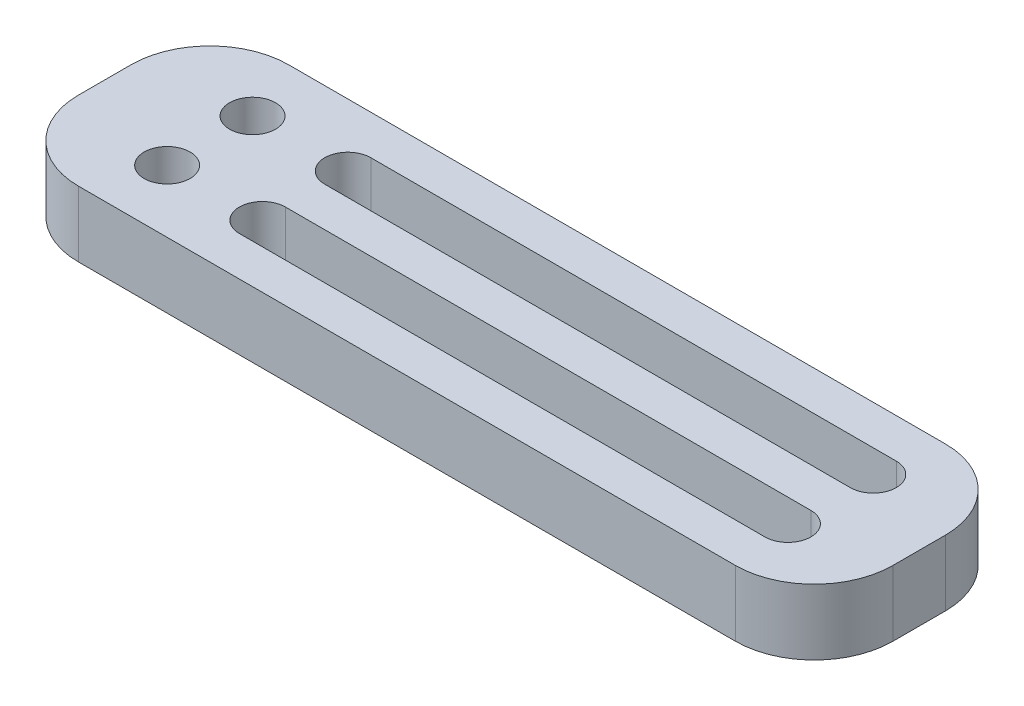
ISO-10303-21;
HEADER;
FILE_DESCRIPTION(('STEP AP214'),'2;1');
FILE_NAME('part.step','',(''),(''),'','','');
FILE_SCHEMA(('AUTOMOTIVE_DESIGN { 1 0 10303 214 1 1 1 1 }'));
ENDSEC;
DATA;
#1=APPLICATION_CONTEXT('core data for automotive mechanical design processes');
#2=APPLICATION_PROTOCOL_DEFINITION('international standard','automotive_design',2000,#1);
#3=PRODUCT_CONTEXT('',#1,'mechanical');
#4=PRODUCT('Part','Part','',(#3));
#5=PRODUCT_RELATED_PRODUCT_CATEGORY('part','',(#4));
#6=PRODUCT_DEFINITION_FORMATION('','',#4);
#7=PRODUCT_DEFINITION_CONTEXT('part definition',#1,'design');
#8=PRODUCT_DEFINITION('design','',#6,#7);
#9=PRODUCT_DEFINITION_SHAPE('','',#8);
#10=(LENGTH_UNIT() NAMED_UNIT(*) SI_UNIT(.MILLI.,.METRE.));
#11=(NAMED_UNIT(*) PLANE_ANGLE_UNIT() SI_UNIT($,.RADIAN.));
#12=(NAMED_UNIT(*) SI_UNIT($,.STERADIAN.) SOLID_ANGLE_UNIT());
#13=UNCERTAINTY_MEASURE_WITH_UNIT(LENGTH_MEASURE(1.E-05),#10,'distance_accuracy_value','');
#14=(GEOMETRIC_REPRESENTATION_CONTEXT(3) GLOBAL_UNCERTAINTY_ASSIGNED_CONTEXT((#13)) GLOBAL_UNIT_ASSIGNED_CONTEXT((#10,
#11,#12)) REPRESENTATION_CONTEXT('',''));
#15=CARTESIAN_POINT('',(0.,0.,0.));
#16=DIRECTION('',(0.,0.,1.));
#17=DIRECTION('',(1.,0.,0.));
#18=AXIS2_PLACEMENT_3D('',#15,#16,#17);
#19=CARTESIAN_POINT('',(56.,-5.,4.));
#20=DIRECTION('',(0.,1.,0.));
#21=DIRECTION('',(0.,0.,1.));
#22=AXIS2_PLACEMENT_3D('',#19,#20,#21);
#23=CYLINDRICAL_SURFACE('',#22,6.);
#24=CARTESIAN_POINT('',(56.,0.,4.));
#25=DIRECTION('',(0.,1.,0.));
#26=DIRECTION('',(0.,0.,-1.));
#27=AXIS2_PLACEMENT_3D('',#24,#25,#26);
#28=CIRCLE('',#27,6.);
#29=CARTESIAN_POINT('',(56.,0.,10.));
#30=VERTEX_POINT('',#29);
#31=CARTESIAN_POINT('',(62.,0.,4.));
#32=VERTEX_POINT('',#31);
#33=EDGE_CURVE('E221',#30,#32,#28,.T.);
#34=ORIENTED_EDGE('',*,*,#33,.F.);
#35=DIRECTION('',(0.,1.,0.));
#36=VECTOR('',#35,1.);
#37=CARTESIAN_POINT('',(56.,-5.,10.));
#38=LINE('',#37,#36);
#39=CARTESIAN_POINT('',(56.,-5.,10.));
#40=VERTEX_POINT('',#39);
#41=EDGE_CURVE('E11',#40,#30,#38,.T.);
#42=ORIENTED_EDGE('',*,*,#41,.F.);
#43=CARTESIAN_POINT('',(56.,-5.,4.));
#44=DIRECTION('',(0.,1.,0.));
#45=DIRECTION('',(0.,0.,-1.));
#46=AXIS2_PLACEMENT_3D('',#43,#44,#45);
#47=CIRCLE('',#46,6.);
#48=CARTESIAN_POINT('',(62.,-5.,4.));
#49=VERTEX_POINT('',#48);
#50=EDGE_CURVE('E224',#40,#49,#47,.T.);
#51=ORIENTED_EDGE('',*,*,#50,.T.);
#52=DIRECTION('',(0.,1.,0.));
#53=VECTOR('',#52,1.);
#54=CARTESIAN_POINT('',(62.,-5.,4.));
#55=LINE('',#54,#53);
#56=EDGE_CURVE('E35',#49,#32,#55,.T.);
#57=ORIENTED_EDGE('',*,*,#56,.T.);
#58=EDGE_LOOP('',(#34,#42,#51,#57));
#59=FACE_BOUND('',#58,.T.);
#60=ADVANCED_FACE('F32',(#59),#23,.T.);
#61=CARTESIAN_POINT('',(6.,-5.,10.));
#62=DIRECTION('',(0.,0.,1.));
#63=DIRECTION('',(1.,0.,0.));
#64=AXIS2_PLACEMENT_3D('',#61,#62,#63);
#65=PLANE('',#64);
#66=DIRECTION('',(1.,0.,0.));
#67=VECTOR('',#66,1.);
#68=CARTESIAN_POINT('',(6.,0.,10.));
#69=LINE('',#68,#67);
#70=CARTESIAN_POINT('',(6.,0.,10.));
#71=VERTEX_POINT('',#70);
#72=EDGE_CURVE('E228',#71,#30,#69,.T.);
#73=ORIENTED_EDGE('',*,*,#72,.F.);
#74=DIRECTION('',(0.,1.,0.));
#75=VECTOR('',#74,1.);
#76=CARTESIAN_POINT('',(6.,-5.,10.));
#77=LINE('',#76,#75);
#78=CARTESIAN_POINT('',(6.,-5.,10.));
#79=VERTEX_POINT('',#78);
#80=EDGE_CURVE('E40',#79,#71,#77,.T.);
#81=ORIENTED_EDGE('',*,*,#80,.F.);
#82=DIRECTION('',(1.,0.,0.));
#83=VECTOR('',#82,1.);
#84=CARTESIAN_POINT('',(6.,-5.,10.));
#85=LINE('',#84,#83);
#86=EDGE_CURVE('E246',#79,#40,#85,.T.);
#87=ORIENTED_EDGE('',*,*,#86,.T.);
#88=ORIENTED_EDGE('',*,*,#41,.T.);
#89=EDGE_LOOP('',(#73,#81,#87,#88));
#90=FACE_BOUND('',#89,.T.);
#91=ADVANCED_FACE('F293',(#90),#65,.T.);
#92=CARTESIAN_POINT('',(6.,-5.,4.));
#93=DIRECTION('',(0.,1.,0.));
#94=DIRECTION('',(0.,0.,1.));
#95=AXIS2_PLACEMENT_3D('',#92,#93,#94);
#96=CYLINDRICAL_SURFACE('',#95,6.);
#97=CARTESIAN_POINT('',(6.,0.,4.));
#98=DIRECTION('',(0.,1.,0.));
#99=DIRECTION('',(0.,0.,-1.));
#100=AXIS2_PLACEMENT_3D('',#97,#98,#99);
#101=CIRCLE('',#100,6.);
#102=CARTESIAN_POINT('',(0.,0.,4.));
#103=VERTEX_POINT('',#102);
#104=EDGE_CURVE('E266',#103,#71,#101,.T.);
#105=ORIENTED_EDGE('',*,*,#104,.F.);
#106=DIRECTION('',(0.,1.,0.));
#107=VECTOR('',#106,1.);
#108=CARTESIAN_POINT('',(0.,-5.,4.));
#109=LINE('',#108,#107);
#110=CARTESIAN_POINT('',(0.,-5.,4.));
#111=VERTEX_POINT('',#110);
#112=EDGE_CURVE('E272',#111,#103,#109,.T.);
#113=ORIENTED_EDGE('',*,*,#112,.F.);
#114=CARTESIAN_POINT('',(6.,-5.,4.));
#115=DIRECTION('',(0.,1.,0.));
#116=DIRECTION('',(0.,0.,-1.));
#117=AXIS2_PLACEMENT_3D('',#114,#115,#116);
#118=CIRCLE('',#117,6.);
#119=EDGE_CURVE('E243',#111,#79,#118,.T.);
#120=ORIENTED_EDGE('',*,*,#119,.T.);
#121=ORIENTED_EDGE('',*,*,#80,.T.);
#122=EDGE_LOOP('',(#105,#113,#120,#121));
#123=FACE_BOUND('',#122,.T.);
#124=ADVANCED_FACE('F313',(#123),#96,.T.);
#125=CARTESIAN_POINT('',(0.,-5.,0.));
#126=DIRECTION('',(-1.,0.,0.));
#127=DIRECTION('',(0.,0.,1.));
#128=AXIS2_PLACEMENT_3D('',#125,#126,#127);
#129=PLANE('',#128);
#130=DIRECTION('',(0.,0.,1.));
#131=VECTOR('',#130,1.);
#132=CARTESIAN_POINT('',(0.,0.,0.));
#133=LINE('',#132,#131);
#134=CARTESIAN_POINT('',(0.,0.,0.));
#135=VERTEX_POINT('',#134);
#136=EDGE_CURVE('E263',#135,#103,#133,.T.);
#137=ORIENTED_EDGE('',*,*,#136,.F.);
#138=DIRECTION('',(0.,1.,0.));
#139=VECTOR('',#138,1.);
#140=CARTESIAN_POINT('',(0.,-5.,0.));
#141=LINE('',#140,#139);
#142=CARTESIAN_POINT('',(0.,-5.,0.));
#143=VERTEX_POINT('',#142);
#144=EDGE_CURVE('E274',#143,#135,#141,.T.);
#145=ORIENTED_EDGE('',*,*,#144,.F.);
#146=DIRECTION('',(0.,0.,1.));
#147=VECTOR('',#146,1.);
#148=CARTESIAN_POINT('',(0.,-5.,0.));
#149=LINE('',#148,#147);
#150=EDGE_CURVE('E240',#143,#111,#149,.T.);
#151=ORIENTED_EDGE('',*,*,#150,.T.);
#152=ORIENTED_EDGE('',*,*,#112,.T.);
#153=EDGE_LOOP('',(#137,#145,#151,#152));
#154=FACE_BOUND('',#153,.T.);
#155=ADVANCED_FACE('F311',(#154),#129,.T.);
#156=CARTESIAN_POINT('',(6.,-5.,0.));
#157=DIRECTION('',(0.,1.,0.));
#158=DIRECTION('',(0.,0.,1.));
#159=AXIS2_PLACEMENT_3D('',#156,#157,#158);
#160=CYLINDRICAL_SURFACE('',#159,6.);
#161=CARTESIAN_POINT('',(6.,0.,0.));
#162=DIRECTION('',(0.,1.,0.));
#163=DIRECTION('',(0.,0.,1.));
#164=AXIS2_PLACEMENT_3D('',#161,#162,#163);
#165=CIRCLE('',#164,6.);
#166=CARTESIAN_POINT('',(6.,0.,-6.00000000000001));
#167=VERTEX_POINT('',#166);
#168=EDGE_CURVE('E260',#167,#135,#165,.T.);
#169=ORIENTED_EDGE('',*,*,#168,.F.);
#170=DIRECTION('',(0.,1.,0.));
#171=VECTOR('',#170,1.);
#172=CARTESIAN_POINT('',(6.,-5.,-6.00000000000001));
#173=LINE('',#172,#171);
#174=CARTESIAN_POINT('',(6.,-5.,-6.00000000000001));
#175=VERTEX_POINT('',#174);
#176=EDGE_CURVE('E276',#175,#167,#173,.T.);
#177=ORIENTED_EDGE('',*,*,#176,.F.);
#178=CARTESIAN_POINT('',(6.,-5.,0.));
#179=DIRECTION('',(0.,1.,0.));
#180=DIRECTION('',(0.,0.,1.));
#181=AXIS2_PLACEMENT_3D('',#178,#179,#180);
#182=CIRCLE('',#181,6.);
#183=EDGE_CURVE('E237',#175,#143,#182,.T.);
#184=ORIENTED_EDGE('',*,*,#183,.T.);
#185=ORIENTED_EDGE('',*,*,#144,.T.);
#186=EDGE_LOOP('',(#169,#177,#184,#185));
#187=FACE_BOUND('',#186,.T.);
#188=ADVANCED_FACE('F307',(#187),#160,.T.);
#189=CARTESIAN_POINT('',(6.,-5.,-6.00000000000001));
#190=DIRECTION('',(0.,0.,-1.));
#191=DIRECTION('',(-1.,0.,0.));
#192=AXIS2_PLACEMENT_3D('',#189,#190,#191);
#193=PLANE('',#192);
#194=DIRECTION('',(-1.,0.,0.));
#195=VECTOR('',#194,1.);
#196=CARTESIAN_POINT('',(6.,0.,-6.00000000000001));
#197=LINE('',#196,#195);
#198=CARTESIAN_POINT('',(56.,0.,-6.00000000000001));
#199=VERTEX_POINT('',#198);
#200=EDGE_CURVE('E257',#199,#167,#197,.T.);
#201=ORIENTED_EDGE('',*,*,#200,.F.);
#202=DIRECTION('',(0.,1.,0.));
#203=VECTOR('',#202,1.);
#204=CARTESIAN_POINT('',(56.,-5.,-6.00000000000001));
#205=LINE('',#204,#203);
#206=CARTESIAN_POINT('',(56.,-5.,-6.00000000000001));
#207=VERTEX_POINT('',#206);
#208=EDGE_CURVE('E278',#207,#199,#205,.T.);
#209=ORIENTED_EDGE('',*,*,#208,.F.);
#210=DIRECTION('',(-1.,0.,0.));
#211=VECTOR('',#210,1.);
#212=CARTESIAN_POINT('',(6.,-5.,-6.00000000000001));
#213=LINE('',#212,#211);
#214=EDGE_CURVE('E234',#207,#175,#213,.T.);
#215=ORIENTED_EDGE('',*,*,#214,.T.);
#216=ORIENTED_EDGE('',*,*,#176,.T.);
#217=EDGE_LOOP('',(#201,#209,#215,#216));
#218=FACE_BOUND('',#217,.T.);
#219=ADVANCED_FACE('F305',(#218),#193,.T.);
#220=CARTESIAN_POINT('',(56.,-5.,0.));
#221=DIRECTION('',(0.,1.,0.));
#222=DIRECTION('',(0.,0.,1.));
#223=AXIS2_PLACEMENT_3D('',#220,#221,#222);
#224=CYLINDRICAL_SURFACE('',#223,6.);
#225=CARTESIAN_POINT('',(56.,0.,0.));
#226=DIRECTION('',(0.,1.,0.));
#227=DIRECTION('',(0.,0.,1.));
#228=AXIS2_PLACEMENT_3D('',#225,#226,#227);
#229=CIRCLE('',#228,6.);
#230=CARTESIAN_POINT('',(62.,0.,0.));
#231=VERTEX_POINT('',#230);
#232=EDGE_CURVE('E254',#231,#199,#229,.T.);
#233=ORIENTED_EDGE('',*,*,#232,.F.);
#234=DIRECTION('',(0.,1.,0.));
#235=VECTOR('',#234,1.);
#236=CARTESIAN_POINT('',(62.,-5.,0.));
#237=LINE('',#236,#235);
#238=CARTESIAN_POINT('',(62.,-5.,0.));
#239=VERTEX_POINT('',#238);
#240=EDGE_CURVE('E279',#239,#231,#237,.T.);
#241=ORIENTED_EDGE('',*,*,#240,.F.);
#242=CARTESIAN_POINT('',(56.,-5.,0.));
#243=DIRECTION('',(0.,1.,0.));
#244=DIRECTION('',(0.,0.,1.));
#245=AXIS2_PLACEMENT_3D('',#242,#243,#244);
#246=CIRCLE('',#245,6.);
#247=EDGE_CURVE('E231',#239,#207,#246,.T.);
#248=ORIENTED_EDGE('',*,*,#247,.T.);
#249=ORIENTED_EDGE('',*,*,#208,.T.);
#250=EDGE_LOOP('',(#233,#241,#248,#249));
#251=FACE_BOUND('',#250,.T.);
#252=ADVANCED_FACE('F301',(#251),#224,.T.);
#253=CARTESIAN_POINT('',(62.,-5.,0.));
#254=DIRECTION('',(1.,0.,0.));
#255=DIRECTION('',(0.,0.,-1.));
#256=AXIS2_PLACEMENT_3D('',#253,#254,#255);
#257=PLANE('',#256);
#258=DIRECTION('',(0.,0.,-1.));
#259=VECTOR('',#258,1.);
#260=CARTESIAN_POINT('',(62.,0.,0.));
#261=LINE('',#260,#259);
#262=EDGE_CURVE('E251',#32,#231,#261,.T.);
#263=ORIENTED_EDGE('',*,*,#262,.F.);
#264=ORIENTED_EDGE('',*,*,#56,.F.);
#265=DIRECTION('',(0.,0.,-1.));
#266=VECTOR('',#265,1.);
#267=CARTESIAN_POINT('',(62.,-5.,0.));
#268=LINE('',#267,#266);
#269=EDGE_CURVE('E227',#49,#239,#268,.T.);
#270=ORIENTED_EDGE('',*,*,#269,.T.);
#271=ORIENTED_EDGE('',*,*,#240,.T.);
#272=EDGE_LOOP('',(#263,#264,#270,#271));
#273=FACE_BOUND('',#272,.T.);
#274=ADVANCED_FACE('F287',(#273),#257,.T.);
#275=CARTESIAN_POINT('',(56.,-5.,4.));
#276=DIRECTION('',(0.,-1.,0.));
#277=DIRECTION('',(0.,0.,-1.));
#278=AXIS2_PLACEMENT_3D('',#275,#276,#277);
#279=PLANE('',#278);
#280=CARTESIAN_POINT('',(8.,-5.,5.25));
#281=DIRECTION('',(0.,1.,0.));
#282=DIRECTION('',(0.,0.,-1.));
#283=AXIS2_PLACEMENT_3D('',#280,#281,#282);
#284=CIRCLE('',#283,1.75);
#285=CARTESIAN_POINT('',(8.,-5.,3.5));
#286=VERTEX_POINT('',#285);
#287=EDGE_CURVE('E176',#286,#286,#284,.T.);
#288=ORIENTED_EDGE('',*,*,#287,.T.);
#289=EDGE_LOOP('',(#288));
#290=FACE_BOUND('',#289,.T.);
#291=CARTESIAN_POINT('',(15.25,-5.,-1.25));
#292=DIRECTION('',(0.,1.,0.));
#293=DIRECTION('',(0.,0.,1.));
#294=AXIS2_PLACEMENT_3D('',#291,#292,#293);
#295=CIRCLE('',#294,1.75);
#296=CARTESIAN_POINT('',(15.25,-5.,-3.));
#297=VERTEX_POINT('',#296);
#298=CARTESIAN_POINT('',(15.25,-5.,0.499999999999999));
#299=VERTEX_POINT('',#298);
#300=EDGE_CURVE('E147',#297,#299,#295,.T.);
#301=ORIENTED_EDGE('',*,*,#300,.T.);
#302=DIRECTION('',(1.,0.,0.));
#303=VECTOR('',#302,1.);
#304=CARTESIAN_POINT('',(15.25,-5.,0.499999999999999));
#305=LINE('',#304,#303);
#306=CARTESIAN_POINT('',(55.25,-5.,0.499999999999997));
#307=VERTEX_POINT('',#306);
#308=EDGE_CURVE('E156',#299,#307,#305,.T.);
#309=ORIENTED_EDGE('',*,*,#308,.T.);
#310=CARTESIAN_POINT('',(55.25,-5.,-1.25));
#311=DIRECTION('',(0.,1.,0.));
#312=DIRECTION('',(0.,0.,1.));
#313=AXIS2_PLACEMENT_3D('',#310,#311,#312);
#314=CIRCLE('',#313,1.75);
#315=CARTESIAN_POINT('',(55.25,-5.,-3.));
#316=VERTEX_POINT('',#315);
#317=EDGE_CURVE('E48',#307,#316,#314,.T.);
#318=ORIENTED_EDGE('',*,*,#317,.T.);
#319=DIRECTION('',(-1.,0.,0.));
#320=VECTOR('',#319,1.);
#321=CARTESIAN_POINT('',(15.25,-5.,-3.));
#322=LINE('',#321,#320);
#323=EDGE_CURVE('E153',#316,#297,#322,.T.);
#324=ORIENTED_EDGE('',*,*,#323,.T.);
#325=EDGE_LOOP('',(#301,#309,#318,#324));
#326=FACE_BOUND('',#325,.T.);
#327=CARTESIAN_POINT('',(15.25,-5.,5.25));
#328=DIRECTION('',(0.,1.,0.));
#329=DIRECTION('',(0.,0.,-1.));
#330=AXIS2_PLACEMENT_3D('',#327,#328,#329);
#331=CIRCLE('',#330,1.75);
#332=CARTESIAN_POINT('',(15.25,-5.,3.5));
#333=VERTEX_POINT('',#332);
#334=CARTESIAN_POINT('',(15.25,-5.,7.));
#335=VERTEX_POINT('',#334);
#336=EDGE_CURVE('E186',#333,#335,#331,.T.);
#337=ORIENTED_EDGE('',*,*,#336,.T.);
#338=DIRECTION('',(1.,0.,0.));
#339=VECTOR('',#338,1.);
#340=CARTESIAN_POINT('',(15.25,-5.,7.));
#341=LINE('',#340,#339);
#342=CARTESIAN_POINT('',(55.25,-5.,6.99999999999999));
#343=VERTEX_POINT('',#342);
#344=EDGE_CURVE('E189',#335,#343,#341,.T.);
#345=ORIENTED_EDGE('',*,*,#344,.T.);
#346=CARTESIAN_POINT('',(55.25,-5.,5.24999999999999));
#347=DIRECTION('',(0.,1.,0.));
#348=DIRECTION('',(0.,0.,-1.));
#349=AXIS2_PLACEMENT_3D('',#346,#347,#348);
#350=CIRCLE('',#349,1.75);
#351=CARTESIAN_POINT('',(55.25,-5.,3.49999999999999));
#352=VERTEX_POINT('',#351);
#353=EDGE_CURVE('E193',#343,#352,#350,.T.);
#354=ORIENTED_EDGE('',*,*,#353,.T.);
#355=DIRECTION('',(-1.,0.,0.));
#356=VECTOR('',#355,1.);
#357=CARTESIAN_POINT('',(15.25,-5.,3.5));
#358=LINE('',#357,#356);
#359=EDGE_CURVE('E196',#352,#333,#358,.T.);
#360=ORIENTED_EDGE('',*,*,#359,.T.);
#361=EDGE_LOOP('',(#337,#345,#354,#360));
#362=FACE_BOUND('',#361,.T.);
#363=CARTESIAN_POINT('',(8.,-5.,-1.25));
#364=DIRECTION('',(0.,1.,0.));
#365=DIRECTION('',(0.,0.,1.));
#366=AXIS2_PLACEMENT_3D('',#363,#364,#365);
#367=CIRCLE('',#366,1.75);
#368=CARTESIAN_POINT('',(8.,-5.,0.5));
#369=VERTEX_POINT('',#368);
#370=EDGE_CURVE('E218',#369,#369,#367,.T.);
#371=ORIENTED_EDGE('',*,*,#370,.T.);
#372=EDGE_LOOP('',(#371));
#373=FACE_BOUND('',#372,.T.);
#374=ORIENTED_EDGE('',*,*,#50,.F.);
#375=ORIENTED_EDGE('',*,*,#86,.F.);
#376=ORIENTED_EDGE('',*,*,#119,.F.);
#377=ORIENTED_EDGE('',*,*,#150,.F.);
#378=ORIENTED_EDGE('',*,*,#183,.F.);
#379=ORIENTED_EDGE('',*,*,#214,.F.);
#380=ORIENTED_EDGE('',*,*,#247,.F.);
#381=ORIENTED_EDGE('',*,*,#269,.F.);
#382=EDGE_LOOP('',(#374,#375,#376,#377,#378,#379,#380,#381));
#383=FACE_BOUND('',#382,.T.);
#384=ADVANCED_FACE('F160',(#290,#326,#362,#373,#383),#279,.T.);
#385=CARTESIAN_POINT('',(56.,0.,4.));
#386=DIRECTION('',(0.,-1.,0.));
#387=DIRECTION('',(0.,0.,-1.));
#388=AXIS2_PLACEMENT_3D('',#385,#386,#387);
#389=PLANE('',#388);
#390=CARTESIAN_POINT('',(8.,0.,5.25));
#391=DIRECTION('',(0.,1.,0.));
#392=DIRECTION('',(0.,0.,-1.));
#393=AXIS2_PLACEMENT_3D('',#390,#391,#392);
#394=CIRCLE('',#393,1.75);
#395=CARTESIAN_POINT('',(8.,0.,3.5));
#396=VERTEX_POINT('',#395);
#397=EDGE_CURVE('E169',#396,#396,#394,.T.);
#398=ORIENTED_EDGE('',*,*,#397,.F.);
#399=EDGE_LOOP('',(#398));
#400=FACE_BOUND('',#399,.T.);
#401=DIRECTION('',(1.,0.,0.));
#402=VECTOR('',#401,1.);
#403=CARTESIAN_POINT('',(15.25,0.,0.499999999999999));
#404=LINE('',#403,#402);
#405=CARTESIAN_POINT('',(15.25,0.,0.499999999999999));
#406=VERTEX_POINT('',#405);
#407=CARTESIAN_POINT('',(55.25,0.,0.499999999999998));
#408=VERTEX_POINT('',#407);
#409=EDGE_CURVE('E175',#406,#408,#404,.T.);
#410=ORIENTED_EDGE('',*,*,#409,.F.);
#411=CARTESIAN_POINT('',(15.25,0.,-1.25));
#412=DIRECTION('',(0.,1.,0.));
#413=DIRECTION('',(0.,0.,1.));
#414=AXIS2_PLACEMENT_3D('',#411,#412,#413);
#415=CIRCLE('',#414,1.75);
#416=CARTESIAN_POINT('',(15.25,0.,-3.));
#417=VERTEX_POINT('',#416);
#418=EDGE_CURVE('E56',#417,#406,#415,.T.);
#419=ORIENTED_EDGE('',*,*,#418,.F.);
#420=DIRECTION('',(-1.,0.,0.));
#421=VECTOR('',#420,1.);
#422=CARTESIAN_POINT('',(15.25,0.,-3.));
#423=LINE('',#422,#421);
#424=CARTESIAN_POINT('',(55.25,0.,-3.));
#425=VERTEX_POINT('',#424);
#426=EDGE_CURVE('E163',#425,#417,#423,.T.);
#427=ORIENTED_EDGE('',*,*,#426,.F.);
#428=CARTESIAN_POINT('',(55.25,0.,-1.25));
#429=DIRECTION('',(0.,1.,0.));
#430=DIRECTION('',(0.,0.,1.));
#431=AXIS2_PLACEMENT_3D('',#428,#429,#430);
#432=CIRCLE('',#431,1.75);
#433=EDGE_CURVE('E166',#408,#425,#432,.T.);
#434=ORIENTED_EDGE('',*,*,#433,.F.);
#435=EDGE_LOOP('',(#410,#419,#427,#434));
#436=FACE_BOUND('',#435,.T.);
#437=DIRECTION('',(1.,0.,0.));
#438=VECTOR('',#437,1.);
#439=CARTESIAN_POINT('',(15.25,0.,7.));
#440=LINE('',#439,#438);
#441=CARTESIAN_POINT('',(15.25,0.,7.));
#442=VERTEX_POINT('',#441);
#443=CARTESIAN_POINT('',(55.25,0.,6.99999999999999));
#444=VERTEX_POINT('',#443);
#445=EDGE_CURVE('E201',#442,#444,#440,.T.);
#446=ORIENTED_EDGE('',*,*,#445,.F.);
#447=CARTESIAN_POINT('',(15.25,0.,5.25));
#448=DIRECTION('',(0.,1.,0.));
#449=DIRECTION('',(0.,0.,-1.));
#450=AXIS2_PLACEMENT_3D('',#447,#448,#449);
#451=CIRCLE('',#450,1.75);
#452=CARTESIAN_POINT('',(15.25,0.,3.5));
#453=VERTEX_POINT('',#452);
#454=EDGE_CURVE('E182',#453,#442,#451,.T.);
#455=ORIENTED_EDGE('',*,*,#454,.F.);
#456=DIRECTION('',(-1.,0.,0.));
#457=VECTOR('',#456,1.);
#458=CARTESIAN_POINT('',(15.25,0.,3.5));
#459=LINE('',#458,#457);
#460=CARTESIAN_POINT('',(55.25,0.,3.49999999999999));
#461=VERTEX_POINT('',#460);
#462=EDGE_CURVE('E190',#461,#453,#459,.T.);
#463=ORIENTED_EDGE('',*,*,#462,.F.);
#464=CARTESIAN_POINT('',(55.25,0.,5.24999999999999));
#465=DIRECTION('',(0.,1.,0.));
#466=DIRECTION('',(0.,0.,-1.));
#467=AXIS2_PLACEMENT_3D('',#464,#465,#466);
#468=CIRCLE('',#467,1.75);
#469=EDGE_CURVE('E204',#444,#461,#468,.T.);
#470=ORIENTED_EDGE('',*,*,#469,.F.);
#471=EDGE_LOOP('',(#446,#455,#463,#470));
#472=FACE_BOUND('',#471,.T.);
#473=CARTESIAN_POINT('',(8.,0.,-1.25));
#474=DIRECTION('',(0.,1.,0.));
#475=DIRECTION('',(0.,0.,1.));
#476=AXIS2_PLACEMENT_3D('',#473,#474,#475);
#477=CIRCLE('',#476,1.75);
#478=CARTESIAN_POINT('',(8.,0.,0.5));
#479=VERTEX_POINT('',#478);
#480=EDGE_CURVE('E211',#479,#479,#477,.T.);
#481=ORIENTED_EDGE('',*,*,#480,.F.);
#482=EDGE_LOOP('',(#481));
#483=FACE_BOUND('',#482,.T.);
#484=ORIENTED_EDGE('',*,*,#33,.T.);
#485=ORIENTED_EDGE('',*,*,#262,.T.);
#486=ORIENTED_EDGE('',*,*,#232,.T.);
#487=ORIENTED_EDGE('',*,*,#200,.T.);
#488=ORIENTED_EDGE('',*,*,#168,.T.);
#489=ORIENTED_EDGE('',*,*,#136,.T.);
#490=ORIENTED_EDGE('',*,*,#104,.T.);
#491=ORIENTED_EDGE('',*,*,#72,.T.);
#492=EDGE_LOOP('',(#484,#485,#486,#487,#488,#489,#490,#491));
#493=FACE_BOUND('',#492,.T.);
#494=ADVANCED_FACE('F289',(#400,#436,#472,#483,#493),#389,.F.);
#495=CARTESIAN_POINT('',(8.,-5.,-1.25));
#496=DIRECTION('',(0.,1.,0.));
#497=DIRECTION('',(0.,0.,1.));
#498=AXIS2_PLACEMENT_3D('',#495,#496,#497);
#499=CYLINDRICAL_SURFACE('',#498,1.75);
#500=ORIENTED_EDGE('',*,*,#370,.F.);
#501=EDGE_LOOP('',(#500));
#502=FACE_BOUND('',#501,.T.);
#503=ORIENTED_EDGE('',*,*,#480,.T.);
#504=EDGE_LOOP('',(#503));
#505=FACE_BOUND('',#504,.T.);
#506=ADVANCED_FACE('F388',(#502,#505),#499,.F.);
#507=CARTESIAN_POINT('',(15.25,-5.,5.25));
#508=DIRECTION('',(0.,1.,0.));
#509=DIRECTION('',(0.,0.,1.));
#510=AXIS2_PLACEMENT_3D('',#507,#508,#509);
#511=CYLINDRICAL_SURFACE('',#510,1.75);
#512=ORIENTED_EDGE('',*,*,#454,.T.);
#513=DIRECTION('',(0.,1.,0.));
#514=VECTOR('',#513,1.);
#515=CARTESIAN_POINT('',(15.25,-5.,7.));
#516=LINE('',#515,#514);
#517=EDGE_CURVE('E199',#335,#442,#516,.T.);
#518=ORIENTED_EDGE('',*,*,#517,.F.);
#519=ORIENTED_EDGE('',*,*,#336,.F.);
#520=DIRECTION('',(0.,1.,0.));
#521=VECTOR('',#520,1.);
#522=CARTESIAN_POINT('',(15.25,-5.,3.5));
#523=LINE('',#522,#521);
#524=EDGE_CURVE('E209',#333,#453,#523,.T.);
#525=ORIENTED_EDGE('',*,*,#524,.T.);
#526=EDGE_LOOP('',(#512,#518,#519,#525));
#527=FACE_BOUND('',#526,.T.);
#528=ADVANCED_FACE('F398',(#527),#511,.F.);
#529=CARTESIAN_POINT('',(15.25,-5.,3.5));
#530=DIRECTION('',(0.,0.,-1.));
#531=DIRECTION('',(-1.,0.,0.));
#532=AXIS2_PLACEMENT_3D('',#529,#530,#531);
#533=PLANE('',#532);
#534=ORIENTED_EDGE('',*,*,#462,.T.);
#535=ORIENTED_EDGE('',*,*,#524,.F.);
#536=ORIENTED_EDGE('',*,*,#359,.F.);
#537=DIRECTION('',(0.,1.,0.));
#538=VECTOR('',#537,1.);
#539=CARTESIAN_POINT('',(55.25,-5.,3.49999999999999));
#540=LINE('',#539,#538);
#541=EDGE_CURVE('E212',#352,#461,#540,.T.);
#542=ORIENTED_EDGE('',*,*,#541,.T.);
#543=EDGE_LOOP('',(#534,#535,#536,#542));
#544=FACE_BOUND('',#543,.T.);
#545=ADVANCED_FACE('F408',(#544),#533,.F.);
#546=CARTESIAN_POINT('',(55.25,-5.,5.24999999999999));
#547=DIRECTION('',(0.,1.,0.));
#548=DIRECTION('',(0.,0.,1.));
#549=AXIS2_PLACEMENT_3D('',#546,#547,#548);
#550=CYLINDRICAL_SURFACE('',#549,1.75);
#551=ORIENTED_EDGE('',*,*,#469,.T.);
#552=ORIENTED_EDGE('',*,*,#541,.F.);
#553=ORIENTED_EDGE('',*,*,#353,.F.);
#554=DIRECTION('',(0.,1.,0.));
#555=VECTOR('',#554,1.);
#556=CARTESIAN_POINT('',(55.25,-5.,6.99999999999999));
#557=LINE('',#556,#555);
#558=EDGE_CURVE('E214',#343,#444,#557,.T.);
#559=ORIENTED_EDGE('',*,*,#558,.T.);
#560=EDGE_LOOP('',(#551,#552,#553,#559));
#561=FACE_BOUND('',#560,.T.);
#562=ADVANCED_FACE('F418',(#561),#550,.F.);
#563=CARTESIAN_POINT('',(15.25,-5.,7.));
#564=DIRECTION('',(0.,0.,1.));
#565=DIRECTION('',(1.,0.,0.));
#566=AXIS2_PLACEMENT_3D('',#563,#564,#565);
#567=PLANE('',#566);
#568=ORIENTED_EDGE('',*,*,#445,.T.);
#569=ORIENTED_EDGE('',*,*,#558,.F.);
#570=ORIENTED_EDGE('',*,*,#344,.F.);
#571=ORIENTED_EDGE('',*,*,#517,.T.);
#572=EDGE_LOOP('',(#568,#569,#570,#571));
#573=FACE_BOUND('',#572,.T.);
#574=ADVANCED_FACE('F428',(#573),#567,.F.);
#575=CARTESIAN_POINT('',(15.25,-5.,-1.25));
#576=DIRECTION('',(0.,1.,0.));
#577=DIRECTION('',(0.,0.,1.));
#578=AXIS2_PLACEMENT_3D('',#575,#576,#577);
#579=CYLINDRICAL_SURFACE('',#578,1.75);
#580=ORIENTED_EDGE('',*,*,#418,.T.);
#581=DIRECTION('',(0.,1.,0.));
#582=VECTOR('',#581,1.);
#583=CARTESIAN_POINT('',(15.25,-5.,0.499999999999999));
#584=LINE('',#583,#582);
#585=EDGE_CURVE('E143',#299,#406,#584,.T.);
#586=ORIENTED_EDGE('',*,*,#585,.F.);
#587=ORIENTED_EDGE('',*,*,#300,.F.);
#588=DIRECTION('',(0.,1.,0.));
#589=VECTOR('',#588,1.);
#590=CARTESIAN_POINT('',(15.25,-5.,-3.));
#591=LINE('',#590,#589);
#592=EDGE_CURVE('E180',#297,#417,#591,.T.);
#593=ORIENTED_EDGE('',*,*,#592,.T.);
#594=EDGE_LOOP('',(#580,#586,#587,#593));
#595=FACE_BOUND('',#594,.T.);
#596=ADVANCED_FACE('F145',(#595),#579,.F.);
#597=CARTESIAN_POINT('',(15.25,-5.,-3.));
#598=DIRECTION('',(0.,0.,-1.));
#599=DIRECTION('',(-1.,0.,0.));
#600=AXIS2_PLACEMENT_3D('',#597,#598,#599);
#601=PLANE('',#600);
#602=ORIENTED_EDGE('',*,*,#426,.T.);
#603=ORIENTED_EDGE('',*,*,#592,.F.);
#604=ORIENTED_EDGE('',*,*,#323,.F.);
#605=DIRECTION('',(0.,1.,0.));
#606=VECTOR('',#605,1.);
#607=CARTESIAN_POINT('',(55.25,-5.,-3.));
#608=LINE('',#607,#606);
#609=EDGE_CURVE('E183',#316,#425,#608,.T.);
#610=ORIENTED_EDGE('',*,*,#609,.T.);
#611=EDGE_LOOP('',(#602,#603,#604,#610));
#612=FACE_BOUND('',#611,.T.);
#613=ADVANCED_FACE('F447',(#612),#601,.F.);
#614=CARTESIAN_POINT('',(55.25,-5.,-1.25));
#615=DIRECTION('',(0.,1.,0.));
#616=DIRECTION('',(0.,0.,1.));
#617=AXIS2_PLACEMENT_3D('',#614,#615,#616);
#618=CYLINDRICAL_SURFACE('',#617,1.75);
#619=ORIENTED_EDGE('',*,*,#433,.T.);
#620=ORIENTED_EDGE('',*,*,#609,.F.);
#621=ORIENTED_EDGE('',*,*,#317,.F.);
#622=DIRECTION('',(0.,1.,0.));
#623=VECTOR('',#622,1.);
#624=CARTESIAN_POINT('',(55.25,-5.,0.499999999999998));
#625=LINE('',#624,#623);
#626=EDGE_CURVE('E152',#307,#408,#625,.T.);
#627=ORIENTED_EDGE('',*,*,#626,.T.);
#628=EDGE_LOOP('',(#619,#620,#621,#627));
#629=FACE_BOUND('',#628,.T.);
#630=ADVANCED_FACE('F456',(#629),#618,.F.);
#631=CARTESIAN_POINT('',(15.25,-5.,0.499999999999999));
#632=DIRECTION('',(0.,0.,1.));
#633=DIRECTION('',(1.,0.,0.));
#634=AXIS2_PLACEMENT_3D('',#631,#632,#633);
#635=PLANE('',#634);
#636=ORIENTED_EDGE('',*,*,#409,.T.);
#637=ORIENTED_EDGE('',*,*,#626,.F.);
#638=ORIENTED_EDGE('',*,*,#308,.F.);
#639=ORIENTED_EDGE('',*,*,#585,.T.);
#640=EDGE_LOOP('',(#636,#637,#638,#639));
#641=FACE_BOUND('',#640,.T.);
#642=ADVANCED_FACE('F157',(#641),#635,.F.);
#643=CARTESIAN_POINT('',(8.,-5.,5.25));
#644=DIRECTION('',(0.,1.,0.));
#645=DIRECTION('',(0.,0.,1.));
#646=AXIS2_PLACEMENT_3D('',#643,#644,#645);
#647=CYLINDRICAL_SURFACE('',#646,1.75);
#648=ORIENTED_EDGE('',*,*,#287,.F.);
#649=EDGE_LOOP('',(#648));
#650=FACE_BOUND('',#649,.T.);
#651=ORIENTED_EDGE('',*,*,#397,.T.);
#652=EDGE_LOOP('',(#651));
#653=FACE_BOUND('',#652,.T.);
#654=ADVANCED_FACE('F474',(#650,#653),#647,.F.);
#655=CLOSED_SHELL('',(#60,#91,#124,#155,#188,#219,#252,#274,#384,#494,#506,#528,#545,#562,#574,
#596,#613,#630,#642,#654));
#656=MANIFOLD_SOLID_BREP('B2',#655);
#657=ADVANCED_BREP_SHAPE_REPRESENTATION('',(#18,#656),#14);
#658=SHAPE_DEFINITION_REPRESENTATION(#9,#657);
ENDSEC;
END-ISO-10303-21;
